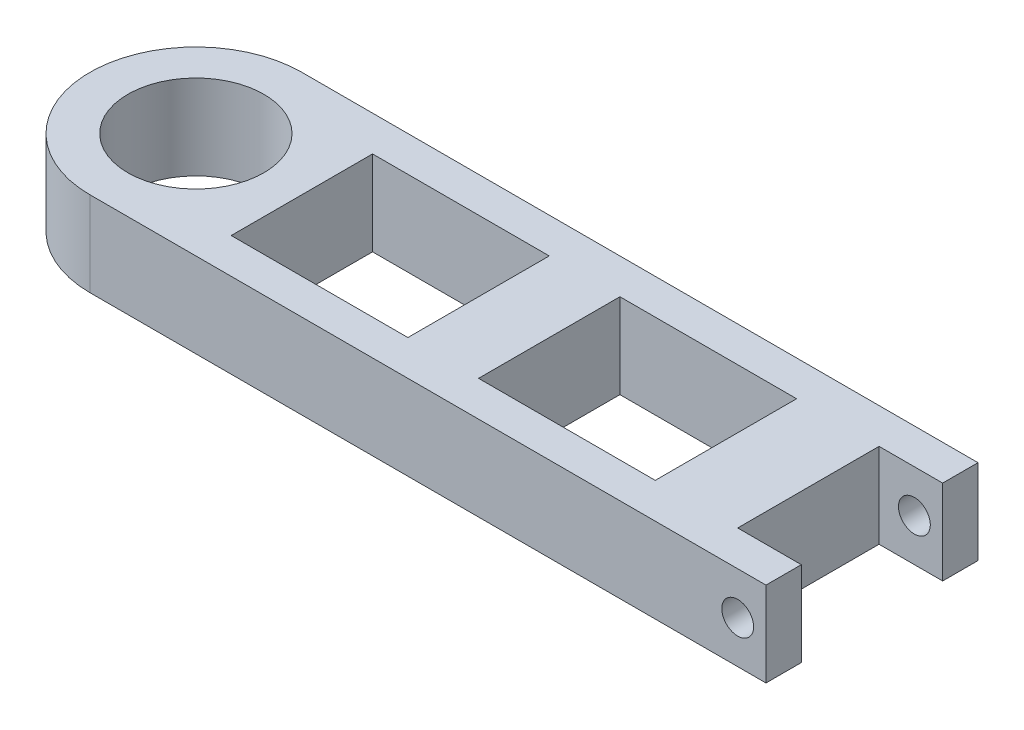
ISO-10303-21;
HEADER;
FILE_DESCRIPTION(('STEP AP214'),'2;1');
FILE_NAME('part.step','',(''),(''),'','','');
FILE_SCHEMA(('AUTOMOTIVE_DESIGN { 1 0 10303 214 1 1 1 1 }'));
ENDSEC;
DATA;
#1=APPLICATION_CONTEXT('core data for automotive mechanical design processes');
#2=APPLICATION_PROTOCOL_DEFINITION('international standard','automotive_design',2000,#1);
#3=PRODUCT_CONTEXT('',#1,'mechanical');
#4=PRODUCT('Part','Part','',(#3));
#5=PRODUCT_RELATED_PRODUCT_CATEGORY('part','',(#4));
#6=PRODUCT_DEFINITION_FORMATION('','',#4);
#7=PRODUCT_DEFINITION_CONTEXT('part definition',#1,'design');
#8=PRODUCT_DEFINITION('design','',#6,#7);
#9=PRODUCT_DEFINITION_SHAPE('','',#8);
#10=(LENGTH_UNIT() NAMED_UNIT(*) SI_UNIT(.MILLI.,.METRE.));
#11=(NAMED_UNIT(*) PLANE_ANGLE_UNIT() SI_UNIT($,.RADIAN.));
#12=(NAMED_UNIT(*) SI_UNIT($,.STERADIAN.) SOLID_ANGLE_UNIT());
#13=UNCERTAINTY_MEASURE_WITH_UNIT(LENGTH_MEASURE(1.E-05),#10,'distance_accuracy_value','');
#14=(GEOMETRIC_REPRESENTATION_CONTEXT(3) GLOBAL_UNCERTAINTY_ASSIGNED_CONTEXT((#13)) GLOBAL_UNIT_ASSIGNED_CONTEXT((#10,
#11,#12)) REPRESENTATION_CONTEXT('',''));
#15=CARTESIAN_POINT('',(0.,0.,0.));
#16=DIRECTION('',(0.,0.,1.));
#17=DIRECTION('',(1.,0.,0.));
#18=AXIS2_PLACEMENT_3D('',#15,#16,#17);
#19=CARTESIAN_POINT('',(-135.,12.,0.));
#20=DIRECTION('',(0.,1.,0.));
#21=DIRECTION('',(0.,0.,1.));
#22=AXIS2_PLACEMENT_3D('',#19,#20,#21);
#23=PLANE('',#22);
#24=DIRECTION('',(1.,0.,0.));
#25=VECTOR('',#24,1.);
#26=CARTESIAN_POINT('',(-120.,12.,10.));
#27=LINE('',#26,#25);
#28=CARTESIAN_POINT('',(-120.,12.,10.));
#29=VERTEX_POINT('',#28);
#30=CARTESIAN_POINT('',(-95.,12.,10.));
#31=VERTEX_POINT('',#30);
#32=EDGE_CURVE('E193',#29,#31,#27,.T.);
#33=ORIENTED_EDGE('',*,*,#32,.F.);
#34=DIRECTION('',(0.,0.,1.));
#35=VECTOR('',#34,1.);
#36=CARTESIAN_POINT('',(-120.,12.,-10.));
#37=LINE('',#36,#35);
#38=CARTESIAN_POINT('',(-120.,12.,-10.));
#39=VERTEX_POINT('',#38);
#40=EDGE_CURVE('E191',#39,#29,#37,.T.);
#41=ORIENTED_EDGE('',*,*,#40,.F.);
#42=DIRECTION('',(-1.,0.,0.));
#43=VECTOR('',#42,1.);
#44=CARTESIAN_POINT('',(-120.,12.,-10.));
#45=LINE('',#44,#43);
#46=CARTESIAN_POINT('',(-95.,12.,-10.));
#47=VERTEX_POINT('',#46);
#48=EDGE_CURVE('E199',#47,#39,#45,.T.);
#49=ORIENTED_EDGE('',*,*,#48,.F.);
#50=DIRECTION('',(0.,0.,-1.));
#51=VECTOR('',#50,1.);
#52=CARTESIAN_POINT('',(-95.,12.,-10.));
#53=LINE('',#52,#51);
#54=EDGE_CURVE('E196',#31,#47,#53,.T.);
#55=ORIENTED_EDGE('',*,*,#54,.F.);
#56=EDGE_LOOP('',(#33,#41,#49,#55));
#57=FACE_BOUND('',#56,.T.);
#58=DIRECTION('',(1.,0.,0.));
#59=VECTOR('',#58,1.);
#60=CARTESIAN_POINT('',(-39.3333,12.,-10.));
#61=LINE('',#60,#59);
#62=CARTESIAN_POINT('',(-48.3333,12.,-10.));
#63=VERTEX_POINT('',#62);
#64=CARTESIAN_POINT('',(-39.3333,12.,-10.));
#65=VERTEX_POINT('',#64);
#66=EDGE_CURVE('E222',#63,#65,#61,.T.);
#67=ORIENTED_EDGE('',*,*,#66,.T.);
#68=DIRECTION('',(0.,0.,-1.));
#69=VECTOR('',#68,1.);
#70=CARTESIAN_POINT('',(-39.3333,12.,-15.));
#71=LINE('',#70,#69);
#72=CARTESIAN_POINT('',(-39.3333,12.,-15.));
#73=VERTEX_POINT('',#72);
#74=EDGE_CURVE('E225',#65,#73,#71,.T.);
#75=ORIENTED_EDGE('',*,*,#74,.T.);
#76=DIRECTION('',(-1.,0.,0.));
#77=VECTOR('',#76,1.);
#78=CARTESIAN_POINT('',(-135.,12.,-15.));
#79=LINE('',#78,#77);
#80=CARTESIAN_POINT('',(-135.,12.,-15.));
#81=VERTEX_POINT('',#80);
#82=EDGE_CURVE('E228',#73,#81,#79,.T.);
#83=ORIENTED_EDGE('',*,*,#82,.T.);
#84=CARTESIAN_POINT('',(-135.,12.,0.));
#85=DIRECTION('',(0.,1.,0.));
#86=DIRECTION('',(0.,0.,1.));
#87=AXIS2_PLACEMENT_3D('',#84,#85,#86);
#88=CIRCLE('',#87,15.);
#89=CARTESIAN_POINT('',(-135.,12.,15.));
#90=VERTEX_POINT('',#89);
#91=EDGE_CURVE('E230',#81,#90,#88,.T.);
#92=ORIENTED_EDGE('',*,*,#91,.T.);
#93=DIRECTION('',(1.,0.,0.));
#94=VECTOR('',#93,1.);
#95=CARTESIAN_POINT('',(-135.,12.,15.));
#96=LINE('',#95,#94);
#97=CARTESIAN_POINT('',(-39.3333,12.,15.));
#98=VERTEX_POINT('',#97);
#99=EDGE_CURVE('E232',#90,#98,#96,.T.);
#100=ORIENTED_EDGE('',*,*,#99,.T.);
#101=DIRECTION('',(0.,0.,-1.));
#102=VECTOR('',#101,1.);
#103=CARTESIAN_POINT('',(-39.3333,12.,10.));
#104=LINE('',#103,#102);
#105=CARTESIAN_POINT('',(-39.3333,12.,10.));
#106=VERTEX_POINT('',#105);
#107=EDGE_CURVE('E234',#98,#106,#104,.T.);
#108=ORIENTED_EDGE('',*,*,#107,.T.);
#109=DIRECTION('',(-1.,0.,0.));
#110=VECTOR('',#109,1.);
#111=CARTESIAN_POINT('',(-48.3333,12.,10.));
#112=LINE('',#111,#110);
#113=CARTESIAN_POINT('',(-48.3333,12.,10.));
#114=VERTEX_POINT('',#113);
#115=EDGE_CURVE('E236',#106,#114,#112,.T.);
#116=ORIENTED_EDGE('',*,*,#115,.T.);
#117=DIRECTION('',(0.,0.,-1.));
#118=VECTOR('',#117,1.);
#119=CARTESIAN_POINT('',(-48.3333,12.,-10.));
#120=LINE('',#119,#118);
#121=EDGE_CURVE('E238',#114,#63,#120,.T.);
#122=ORIENTED_EDGE('',*,*,#121,.T.);
#123=EDGE_LOOP('',(#67,#75,#83,#92,#100,#108,#116,#122));
#124=FACE_BOUND('',#123,.T.);
#125=CARTESIAN_POINT('',(-135.,12.,0.));
#126=DIRECTION('',(0.,1.,0.));
#127=DIRECTION('',(0.,0.,1.));
#128=AXIS2_PLACEMENT_3D('',#125,#126,#127);
#129=CIRCLE('',#128,9.62499999999999);
#130=CARTESIAN_POINT('',(-135.,12.,9.62499999999999));
#131=VERTEX_POINT('',#130);
#132=EDGE_CURVE('E185',#131,#131,#129,.T.);
#133=ORIENTED_EDGE('',*,*,#132,.F.);
#134=EDGE_LOOP('',(#133));
#135=FACE_BOUND('',#134,.T.);
#136=DIRECTION('',(1.,0.,0.));
#137=VECTOR('',#136,1.);
#138=CARTESIAN_POINT('',(-85.,12.,10.));
#139=LINE('',#138,#137);
#140=CARTESIAN_POINT('',(-85.,12.,10.));
#141=VERTEX_POINT('',#140);
#142=CARTESIAN_POINT('',(-60.,12.,10.));
#143=VERTEX_POINT('',#142);
#144=EDGE_CURVE('E155',#141,#143,#139,.T.);
#145=ORIENTED_EDGE('',*,*,#144,.F.);
#146=DIRECTION('',(0.,0.,1.));
#147=VECTOR('',#146,1.);
#148=CARTESIAN_POINT('',(-85.,12.,-10.));
#149=LINE('',#148,#147);
#150=CARTESIAN_POINT('',(-85.,12.,-10.));
#151=VERTEX_POINT('',#150);
#152=EDGE_CURVE('E147',#151,#141,#149,.T.);
#153=ORIENTED_EDGE('',*,*,#152,.F.);
#154=DIRECTION('',(-1.,0.,0.));
#155=VECTOR('',#154,1.);
#156=CARTESIAN_POINT('',(-85.,12.,-10.));
#157=LINE('',#156,#155);
#158=CARTESIAN_POINT('',(-60.,12.,-10.));
#159=VERTEX_POINT('',#158);
#160=EDGE_CURVE('E169',#159,#151,#157,.T.);
#161=ORIENTED_EDGE('',*,*,#160,.F.);
#162=DIRECTION('',(0.,0.,-1.));
#163=VECTOR('',#162,1.);
#164=CARTESIAN_POINT('',(-60.,12.,-10.));
#165=LINE('',#164,#163);
#166=EDGE_CURVE('E167',#143,#159,#165,.T.);
#167=ORIENTED_EDGE('',*,*,#166,.F.);
#168=EDGE_LOOP('',(#145,#153,#161,#167));
#169=FACE_BOUND('',#168,.T.);
#170=ADVANCED_FACE('F33',(#57,#124,#135,#169),#23,.T.);
#171=CARTESIAN_POINT('',(-135.,0.,0.));
#172=DIRECTION('',(0.,1.,0.));
#173=DIRECTION('',(0.,0.,1.));
#174=AXIS2_PLACEMENT_3D('',#171,#172,#173);
#175=PLANE('',#174);
#176=CARTESIAN_POINT('',(-135.,0.,0.));
#177=DIRECTION('',(0.,1.,0.));
#178=DIRECTION('',(0.,0.,1.));
#179=AXIS2_PLACEMENT_3D('',#176,#177,#178);
#180=CIRCLE('',#179,9.62499999999999);
#181=CARTESIAN_POINT('',(-135.,0.,9.62499999999999));
#182=VERTEX_POINT('',#181);
#183=EDGE_CURVE('E163',#182,#182,#180,.T.);
#184=ORIENTED_EDGE('',*,*,#183,.T.);
#185=EDGE_LOOP('',(#184));
#186=FACE_BOUND('',#185,.T.);
#187=DIRECTION('',(0.,0.,1.));
#188=VECTOR('',#187,1.);
#189=CARTESIAN_POINT('',(-120.,0.,-10.));
#190=LINE('',#189,#188);
#191=CARTESIAN_POINT('',(-120.,0.,-10.));
#192=VERTEX_POINT('',#191);
#193=CARTESIAN_POINT('',(-120.,0.,10.));
#194=VERTEX_POINT('',#193);
#195=EDGE_CURVE('E188',#192,#194,#190,.T.);
#196=ORIENTED_EDGE('',*,*,#195,.T.);
#197=DIRECTION('',(1.,0.,0.));
#198=VECTOR('',#197,1.);
#199=CARTESIAN_POINT('',(-120.,0.,10.));
#200=LINE('',#199,#198);
#201=CARTESIAN_POINT('',(-95.,0.,10.));
#202=VERTEX_POINT('',#201);
#203=EDGE_CURVE('E204',#194,#202,#200,.T.);
#204=ORIENTED_EDGE('',*,*,#203,.T.);
#205=DIRECTION('',(0.,0.,-1.));
#206=VECTOR('',#205,1.);
#207=CARTESIAN_POINT('',(-95.,0.,-10.));
#208=LINE('',#207,#206);
#209=CARTESIAN_POINT('',(-95.,0.,-10.));
#210=VERTEX_POINT('',#209);
#211=EDGE_CURVE('E207',#202,#210,#208,.T.);
#212=ORIENTED_EDGE('',*,*,#211,.T.);
#213=DIRECTION('',(-1.,0.,0.));
#214=VECTOR('',#213,1.);
#215=CARTESIAN_POINT('',(-120.,0.,-10.));
#216=LINE('',#215,#214);
#217=EDGE_CURVE('E194',#210,#192,#216,.T.);
#218=ORIENTED_EDGE('',*,*,#217,.T.);
#219=EDGE_LOOP('',(#196,#204,#212,#218));
#220=FACE_BOUND('',#219,.T.);
#221=DIRECTION('',(1.,0.,0.));
#222=VECTOR('',#221,1.);
#223=CARTESIAN_POINT('',(-39.3333,0.,-10.));
#224=LINE('',#223,#222);
#225=CARTESIAN_POINT('',(-48.3333,0.,-10.));
#226=VERTEX_POINT('',#225);
#227=CARTESIAN_POINT('',(-39.3333,0.,-10.));
#228=VERTEX_POINT('',#227);
#229=EDGE_CURVE('E221',#226,#228,#224,.T.);
#230=ORIENTED_EDGE('',*,*,#229,.F.);
#231=DIRECTION('',(0.,0.,-1.));
#232=VECTOR('',#231,1.);
#233=CARTESIAN_POINT('',(-48.3333,0.,-10.));
#234=LINE('',#233,#232);
#235=CARTESIAN_POINT('',(-48.3333,0.,10.));
#236=VERTEX_POINT('',#235);
#237=EDGE_CURVE('E226',#236,#226,#234,.T.);
#238=ORIENTED_EDGE('',*,*,#237,.F.);
#239=DIRECTION('',(-1.,0.,0.));
#240=VECTOR('',#239,1.);
#241=CARTESIAN_POINT('',(-48.3333,0.,10.));
#242=LINE('',#241,#240);
#243=CARTESIAN_POINT('',(-39.3333,0.,10.));
#244=VERTEX_POINT('',#243);
#245=EDGE_CURVE('E253',#244,#236,#242,.T.);
#246=ORIENTED_EDGE('',*,*,#245,.F.);
#247=DIRECTION('',(0.,0.,-1.));
#248=VECTOR('',#247,1.);
#249=CARTESIAN_POINT('',(-39.3333,0.,10.));
#250=LINE('',#249,#248);
#251=CARTESIAN_POINT('',(-39.3333,0.,15.));
#252=VERTEX_POINT('',#251);
#253=EDGE_CURVE('E251',#252,#244,#250,.T.);
#254=ORIENTED_EDGE('',*,*,#253,.F.);
#255=DIRECTION('',(1.,0.,0.));
#256=VECTOR('',#255,1.);
#257=CARTESIAN_POINT('',(-135.,0.,15.));
#258=LINE('',#257,#256);
#259=CARTESIAN_POINT('',(-135.,0.,15.));
#260=VERTEX_POINT('',#259);
#261=EDGE_CURVE('E249',#260,#252,#258,.T.);
#262=ORIENTED_EDGE('',*,*,#261,.F.);
#263=CARTESIAN_POINT('',(-135.,0.,0.));
#264=DIRECTION('',(0.,1.,0.));
#265=DIRECTION('',(0.,0.,1.));
#266=AXIS2_PLACEMENT_3D('',#263,#264,#265);
#267=CIRCLE('',#266,15.);
#268=CARTESIAN_POINT('',(-135.,0.,-15.));
#269=VERTEX_POINT('',#268);
#270=EDGE_CURVE('E247',#269,#260,#267,.T.);
#271=ORIENTED_EDGE('',*,*,#270,.F.);
#272=DIRECTION('',(-1.,0.,0.));
#273=VECTOR('',#272,1.);
#274=CARTESIAN_POINT('',(-135.,0.,-15.));
#275=LINE('',#274,#273);
#276=CARTESIAN_POINT('',(-39.3333,0.,-15.));
#277=VERTEX_POINT('',#276);
#278=EDGE_CURVE('E245',#277,#269,#275,.T.);
#279=ORIENTED_EDGE('',*,*,#278,.F.);
#280=DIRECTION('',(0.,0.,-1.));
#281=VECTOR('',#280,1.);
#282=CARTESIAN_POINT('',(-39.3333,0.,-15.));
#283=LINE('',#282,#281);
#284=EDGE_CURVE('E243',#228,#277,#283,.T.);
#285=ORIENTED_EDGE('',*,*,#284,.F.);
#286=EDGE_LOOP('',(#230,#238,#246,#254,#262,#271,#279,#285));
#287=FACE_BOUND('',#286,.T.);
#288=DIRECTION('',(0.,0.,1.));
#289=VECTOR('',#288,1.);
#290=CARTESIAN_POINT('',(-85.,0.,-10.));
#291=LINE('',#290,#289);
#292=CARTESIAN_POINT('',(-85.,0.,-10.));
#293=VERTEX_POINT('',#292);
#294=CARTESIAN_POINT('',(-85.,0.,10.));
#295=VERTEX_POINT('',#294);
#296=EDGE_CURVE('E57',#293,#295,#291,.T.);
#297=ORIENTED_EDGE('',*,*,#296,.T.);
#298=DIRECTION('',(1.,0.,0.));
#299=VECTOR('',#298,1.);
#300=CARTESIAN_POINT('',(-85.,0.,10.));
#301=LINE('',#300,#299);
#302=CARTESIAN_POINT('',(-60.,0.,10.));
#303=VERTEX_POINT('',#302);
#304=EDGE_CURVE('E162',#295,#303,#301,.T.);
#305=ORIENTED_EDGE('',*,*,#304,.T.);
#306=DIRECTION('',(0.,0.,-1.));
#307=VECTOR('',#306,1.);
#308=CARTESIAN_POINT('',(-60.,0.,-10.));
#309=LINE('',#308,#307);
#310=CARTESIAN_POINT('',(-60.,0.,-10.));
#311=VERTEX_POINT('',#310);
#312=EDGE_CURVE('E177',#303,#311,#309,.T.);
#313=ORIENTED_EDGE('',*,*,#312,.T.);
#314=DIRECTION('',(-1.,0.,0.));
#315=VECTOR('',#314,1.);
#316=CARTESIAN_POINT('',(-85.,0.,-10.));
#317=LINE('',#316,#315);
#318=EDGE_CURVE('E156',#311,#293,#317,.T.);
#319=ORIENTED_EDGE('',*,*,#318,.T.);
#320=EDGE_LOOP('',(#297,#305,#313,#319));
#321=FACE_BOUND('',#320,.T.);
#322=ADVANCED_FACE('F284',(#186,#220,#287,#321),#175,.F.);
#323=CARTESIAN_POINT('',(-39.3333,12.,-10.));
#324=DIRECTION('',(0.,0.,-1.));
#325=DIRECTION('',(-1.,0.,0.));
#326=AXIS2_PLACEMENT_3D('',#323,#324,#325);
#327=PLANE('',#326);
#328=CARTESIAN_POINT('',(-43.3333,6.,-10.));
#329=DIRECTION('',(0.,0.,-1.));
#330=DIRECTION('',(-1.,0.,0.));
#331=AXIS2_PLACEMENT_3D('',#328,#329,#330);
#332=CIRCLE('',#331,2.25);
#333=CARTESIAN_POINT('',(-45.5833,6.,-10.));
#334=VERTEX_POINT('',#333);
#335=EDGE_CURVE('E175',#334,#334,#332,.T.);
#336=ORIENTED_EDGE('',*,*,#335,.T.);
#337=EDGE_LOOP('',(#336));
#338=FACE_BOUND('',#337,.T.);
#339=ORIENTED_EDGE('',*,*,#229,.T.);
#340=DIRECTION('',(0.,-1.,0.));
#341=VECTOR('',#340,1.);
#342=CARTESIAN_POINT('',(-39.3333,12.,-10.));
#343=LINE('',#342,#341);
#344=EDGE_CURVE('E11',#65,#228,#343,.T.);
#345=ORIENTED_EDGE('',*,*,#344,.F.);
#346=ORIENTED_EDGE('',*,*,#66,.F.);
#347=DIRECTION('',(0.,-1.,0.));
#348=VECTOR('',#347,1.);
#349=CARTESIAN_POINT('',(-48.3333,12.,-10.));
#350=LINE('',#349,#348);
#351=EDGE_CURVE('E240',#63,#226,#350,.T.);
#352=ORIENTED_EDGE('',*,*,#351,.T.);
#353=EDGE_LOOP('',(#339,#345,#346,#352));
#354=FACE_BOUND('',#353,.T.);
#355=ADVANCED_FACE('F35',(#338,#354),#327,.F.);
#356=CARTESIAN_POINT('',(-39.3333,12.,-15.));
#357=DIRECTION('',(-1.,0.,0.));
#358=DIRECTION('',(0.,0.,1.));
#359=AXIS2_PLACEMENT_3D('',#356,#357,#358);
#360=PLANE('',#359);
#361=ORIENTED_EDGE('',*,*,#284,.T.);
#362=DIRECTION('',(0.,-1.,0.));
#363=VECTOR('',#362,1.);
#364=CARTESIAN_POINT('',(-39.3333,12.,-15.));
#365=LINE('',#364,#363);
#366=EDGE_CURVE('E42',#73,#277,#365,.T.);
#367=ORIENTED_EDGE('',*,*,#366,.F.);
#368=ORIENTED_EDGE('',*,*,#74,.F.);
#369=ORIENTED_EDGE('',*,*,#344,.T.);
#370=EDGE_LOOP('',(#361,#367,#368,#369));
#371=FACE_BOUND('',#370,.T.);
#372=ADVANCED_FACE('F302',(#371),#360,.F.);
#373=CARTESIAN_POINT('',(-135.,12.,-15.));
#374=DIRECTION('',(0.,0.,1.));
#375=DIRECTION('',(1.,0.,0.));
#376=AXIS2_PLACEMENT_3D('',#373,#374,#375);
#377=PLANE('',#376);
#378=CARTESIAN_POINT('',(-43.3333,6.,-15.));
#379=DIRECTION('',(0.,0.,-1.));
#380=DIRECTION('',(-1.,0.,0.));
#381=AXIS2_PLACEMENT_3D('',#378,#379,#380);
#382=CIRCLE('',#381,2.25);
#383=CARTESIAN_POINT('',(-45.5833,6.,-15.));
#384=VERTEX_POINT('',#383);
#385=EDGE_CURVE('E395',#384,#384,#382,.T.);
#386=ORIENTED_EDGE('',*,*,#385,.F.);
#387=EDGE_LOOP('',(#386));
#388=FACE_BOUND('',#387,.T.);
#389=ORIENTED_EDGE('',*,*,#278,.T.);
#390=DIRECTION('',(0.,-1.,0.));
#391=VECTOR('',#390,1.);
#392=CARTESIAN_POINT('',(-135.,12.,-15.));
#393=LINE('',#392,#391);
#394=EDGE_CURVE('E270',#81,#269,#393,.T.);
#395=ORIENTED_EDGE('',*,*,#394,.F.);
#396=ORIENTED_EDGE('',*,*,#82,.F.);
#397=ORIENTED_EDGE('',*,*,#366,.T.);
#398=EDGE_LOOP('',(#389,#395,#396,#397));
#399=FACE_BOUND('',#398,.T.);
#400=ADVANCED_FACE('F278',(#388,#399),#377,.F.);
#401=CARTESIAN_POINT('',(-135.,12.,0.));
#402=DIRECTION('',(0.,-1.,0.));
#403=DIRECTION('',(0.,0.,-1.));
#404=AXIS2_PLACEMENT_3D('',#401,#402,#403);
#405=CYLINDRICAL_SURFACE('',#404,15.);
#406=ORIENTED_EDGE('',*,*,#270,.T.);
#407=DIRECTION('',(0.,-1.,0.));
#408=VECTOR('',#407,1.);
#409=CARTESIAN_POINT('',(-135.,12.,15.));
#410=LINE('',#409,#408);
#411=EDGE_CURVE('E267',#90,#260,#410,.T.);
#412=ORIENTED_EDGE('',*,*,#411,.F.);
#413=ORIENTED_EDGE('',*,*,#91,.F.);
#414=ORIENTED_EDGE('',*,*,#394,.T.);
#415=EDGE_LOOP('',(#406,#412,#413,#414));
#416=FACE_BOUND('',#415,.T.);
#417=ADVANCED_FACE('F290',(#416),#405,.T.);
#418=CARTESIAN_POINT('',(-135.,12.,15.));
#419=DIRECTION('',(0.,0.,-1.));
#420=DIRECTION('',(-1.,0.,0.));
#421=AXIS2_PLACEMENT_3D('',#418,#419,#420);
#422=PLANE('',#421);
#423=CARTESIAN_POINT('',(-43.3333,6.,15.));
#424=DIRECTION('',(0.,0.,-1.));
#425=DIRECTION('',(-1.,0.,0.));
#426=AXIS2_PLACEMENT_3D('',#423,#424,#425);
#427=CIRCLE('',#426,2.25);
#428=CARTESIAN_POINT('',(-45.5833,6.,15.));
#429=VERTEX_POINT('',#428);
#430=EDGE_CURVE('E400',#429,#429,#427,.T.);
#431=ORIENTED_EDGE('',*,*,#430,.T.);
#432=EDGE_LOOP('',(#431));
#433=FACE_BOUND('',#432,.T.);
#434=ORIENTED_EDGE('',*,*,#261,.T.);
#435=DIRECTION('',(0.,-1.,0.));
#436=VECTOR('',#435,1.);
#437=CARTESIAN_POINT('',(-39.3333,12.,15.));
#438=LINE('',#437,#436);
#439=EDGE_CURVE('E264',#98,#252,#438,.T.);
#440=ORIENTED_EDGE('',*,*,#439,.F.);
#441=ORIENTED_EDGE('',*,*,#99,.F.);
#442=ORIENTED_EDGE('',*,*,#411,.T.);
#443=EDGE_LOOP('',(#434,#440,#441,#442));
#444=FACE_BOUND('',#443,.T.);
#445=ADVANCED_FACE('F294',(#433,#444),#422,.F.);
#446=CARTESIAN_POINT('',(-39.3333,12.,10.));
#447=DIRECTION('',(-1.,0.,0.));
#448=DIRECTION('',(0.,0.,1.));
#449=AXIS2_PLACEMENT_3D('',#446,#447,#448);
#450=PLANE('',#449);
#451=ORIENTED_EDGE('',*,*,#253,.T.);
#452=DIRECTION('',(0.,-1.,0.));
#453=VECTOR('',#452,1.);
#454=CARTESIAN_POINT('',(-39.3333,12.,10.));
#455=LINE('',#454,#453);
#456=EDGE_CURVE('E261',#106,#244,#455,.T.);
#457=ORIENTED_EDGE('',*,*,#456,.F.);
#458=ORIENTED_EDGE('',*,*,#107,.F.);
#459=ORIENTED_EDGE('',*,*,#439,.T.);
#460=EDGE_LOOP('',(#451,#457,#458,#459));
#461=FACE_BOUND('',#460,.T.);
#462=ADVANCED_FACE('F315',(#461),#450,.F.);
#463=CARTESIAN_POINT('',(-48.3333,12.,10.));
#464=DIRECTION('',(0.,0.,1.));
#465=DIRECTION('',(1.,0.,0.));
#466=AXIS2_PLACEMENT_3D('',#463,#464,#465);
#467=PLANE('',#466);
#468=CARTESIAN_POINT('',(-43.3333,6.,10.));
#469=DIRECTION('',(0.,0.,1.));
#470=DIRECTION('',(1.,0.,0.));
#471=AXIS2_PLACEMENT_3D('',#468,#469,#470);
#472=CIRCLE('',#471,2.25);
#473=CARTESIAN_POINT('',(-41.0833,6.,10.));
#474=VERTEX_POINT('',#473);
#475=EDGE_CURVE('E37',#474,#474,#472,.T.);
#476=ORIENTED_EDGE('',*,*,#475,.T.);
#477=EDGE_LOOP('',(#476));
#478=FACE_BOUND('',#477,.T.);
#479=ORIENTED_EDGE('',*,*,#245,.T.);
#480=DIRECTION('',(0.,-1.,0.));
#481=VECTOR('',#480,1.);
#482=CARTESIAN_POINT('',(-48.3333,12.,10.));
#483=LINE('',#482,#481);
#484=EDGE_CURVE('E258',#114,#236,#483,.T.);
#485=ORIENTED_EDGE('',*,*,#484,.F.);
#486=ORIENTED_EDGE('',*,*,#115,.F.);
#487=ORIENTED_EDGE('',*,*,#456,.T.);
#488=EDGE_LOOP('',(#479,#485,#486,#487));
#489=FACE_BOUND('',#488,.T.);
#490=ADVANCED_FACE('F313',(#478,#489),#467,.F.);
#491=CARTESIAN_POINT('',(-48.3333,12.,-10.));
#492=DIRECTION('',(-1.,0.,0.));
#493=DIRECTION('',(0.,0.,1.));
#494=AXIS2_PLACEMENT_3D('',#491,#492,#493);
#495=PLANE('',#494);
#496=ORIENTED_EDGE('',*,*,#237,.T.);
#497=ORIENTED_EDGE('',*,*,#351,.F.);
#498=ORIENTED_EDGE('',*,*,#121,.F.);
#499=ORIENTED_EDGE('',*,*,#484,.T.);
#500=EDGE_LOOP('',(#496,#497,#498,#499));
#501=FACE_BOUND('',#500,.T.);
#502=ADVANCED_FACE('F308',(#501),#495,.F.);
#503=CARTESIAN_POINT('',(-120.,12.,-10.));
#504=DIRECTION('',(1.,0.,0.));
#505=DIRECTION('',(0.,0.,-1.));
#506=AXIS2_PLACEMENT_3D('',#503,#504,#505);
#507=PLANE('',#506);
#508=ORIENTED_EDGE('',*,*,#195,.F.);
#509=DIRECTION('',(0.,-1.,0.));
#510=VECTOR('',#509,1.);
#511=CARTESIAN_POINT('',(-120.,12.,-10.));
#512=LINE('',#511,#510);
#513=EDGE_CURVE('E201',#39,#192,#512,.T.);
#514=ORIENTED_EDGE('',*,*,#513,.F.);
#515=ORIENTED_EDGE('',*,*,#40,.T.);
#516=DIRECTION('',(0.,-1.,0.));
#517=VECTOR('',#516,1.);
#518=CARTESIAN_POINT('',(-120.,12.,10.));
#519=LINE('',#518,#517);
#520=EDGE_CURVE('E218',#29,#194,#519,.T.);
#521=ORIENTED_EDGE('',*,*,#520,.T.);
#522=EDGE_LOOP('',(#508,#514,#515,#521));
#523=FACE_BOUND('',#522,.T.);
#524=ADVANCED_FACE('F336',(#523),#507,.T.);
#525=CARTESIAN_POINT('',(-120.,12.,10.));
#526=DIRECTION('',(0.,0.,-1.));
#527=DIRECTION('',(-1.,0.,0.));
#528=AXIS2_PLACEMENT_3D('',#525,#526,#527);
#529=PLANE('',#528);
#530=ORIENTED_EDGE('',*,*,#203,.F.);
#531=ORIENTED_EDGE('',*,*,#520,.F.);
#532=ORIENTED_EDGE('',*,*,#32,.T.);
#533=DIRECTION('',(0.,-1.,0.));
#534=VECTOR('',#533,1.);
#535=CARTESIAN_POINT('',(-95.,12.,10.));
#536=LINE('',#535,#534);
#537=EDGE_CURVE('E216',#31,#202,#536,.T.);
#538=ORIENTED_EDGE('',*,*,#537,.T.);
#539=EDGE_LOOP('',(#530,#531,#532,#538));
#540=FACE_BOUND('',#539,.T.);
#541=ADVANCED_FACE('F343',(#540),#529,.T.);
#542=CARTESIAN_POINT('',(-95.,12.,-10.));
#543=DIRECTION('',(-1.,0.,0.));
#544=DIRECTION('',(0.,0.,1.));
#545=AXIS2_PLACEMENT_3D('',#542,#543,#544);
#546=PLANE('',#545);
#547=ORIENTED_EDGE('',*,*,#211,.F.);
#548=ORIENTED_EDGE('',*,*,#537,.F.);
#549=ORIENTED_EDGE('',*,*,#54,.T.);
#550=DIRECTION('',(0.,-1.,0.));
#551=VECTOR('',#550,1.);
#552=CARTESIAN_POINT('',(-95.,12.,-10.));
#553=LINE('',#552,#551);
#554=EDGE_CURVE('E214',#47,#210,#553,.T.);
#555=ORIENTED_EDGE('',*,*,#554,.T.);
#556=EDGE_LOOP('',(#547,#548,#549,#555));
#557=FACE_BOUND('',#556,.T.);
#558=ADVANCED_FACE('F348',(#557),#546,.T.);
#559=CARTESIAN_POINT('',(-120.,12.,-10.));
#560=DIRECTION('',(0.,0.,1.));
#561=DIRECTION('',(1.,0.,0.));
#562=AXIS2_PLACEMENT_3D('',#559,#560,#561);
#563=PLANE('',#562);
#564=ORIENTED_EDGE('',*,*,#217,.F.);
#565=ORIENTED_EDGE('',*,*,#554,.F.);
#566=ORIENTED_EDGE('',*,*,#48,.T.);
#567=ORIENTED_EDGE('',*,*,#513,.T.);
#568=EDGE_LOOP('',(#564,#565,#566,#567));
#569=FACE_BOUND('',#568,.T.);
#570=ADVANCED_FACE('F356',(#569),#563,.T.);
#571=CARTESIAN_POINT('',(-135.,12.,0.));
#572=DIRECTION('',(0.,-1.,0.));
#573=DIRECTION('',(0.,0.,-1.));
#574=AXIS2_PLACEMENT_3D('',#571,#572,#573);
#575=CYLINDRICAL_SURFACE('',#574,9.62499999999999);
#576=ORIENTED_EDGE('',*,*,#132,.T.);
#577=EDGE_LOOP('',(#576));
#578=FACE_BOUND('',#577,.T.);
#579=ORIENTED_EDGE('',*,*,#183,.F.);
#580=EDGE_LOOP('',(#579));
#581=FACE_BOUND('',#580,.T.);
#582=ADVANCED_FACE('F367',(#578,#581),#575,.F.);
#583=CARTESIAN_POINT('',(-85.,12.,-10.));
#584=DIRECTION('',(1.,0.,0.));
#585=DIRECTION('',(0.,0.,-1.));
#586=AXIS2_PLACEMENT_3D('',#583,#584,#585);
#587=PLANE('',#586);
#588=ORIENTED_EDGE('',*,*,#296,.F.);
#589=DIRECTION('',(0.,-1.,0.));
#590=VECTOR('',#589,1.);
#591=CARTESIAN_POINT('',(-85.,12.,-10.));
#592=LINE('',#591,#590);
#593=EDGE_CURVE('E151',#151,#293,#592,.T.);
#594=ORIENTED_EDGE('',*,*,#593,.F.);
#595=ORIENTED_EDGE('',*,*,#152,.T.);
#596=DIRECTION('',(0.,-1.,0.));
#597=VECTOR('',#596,1.);
#598=CARTESIAN_POINT('',(-85.,12.,10.));
#599=LINE('',#598,#597);
#600=EDGE_CURVE('E150',#141,#295,#599,.T.);
#601=ORIENTED_EDGE('',*,*,#600,.T.);
#602=EDGE_LOOP('',(#588,#594,#595,#601));
#603=FACE_BOUND('',#602,.T.);
#604=ADVANCED_FACE('F149',(#603),#587,.T.);
#605=CARTESIAN_POINT('',(-85.,12.,10.));
#606=DIRECTION('',(0.,0.,-1.));
#607=DIRECTION('',(-1.,0.,0.));
#608=AXIS2_PLACEMENT_3D('',#605,#606,#607);
#609=PLANE('',#608);
#610=ORIENTED_EDGE('',*,*,#304,.F.);
#611=ORIENTED_EDGE('',*,*,#600,.F.);
#612=ORIENTED_EDGE('',*,*,#144,.T.);
#613=DIRECTION('',(0.,-1.,0.));
#614=VECTOR('',#613,1.);
#615=CARTESIAN_POINT('',(-60.,12.,10.));
#616=LINE('',#615,#614);
#617=EDGE_CURVE('E164',#143,#303,#616,.T.);
#618=ORIENTED_EDGE('',*,*,#617,.T.);
#619=EDGE_LOOP('',(#610,#611,#612,#618));
#620=FACE_BOUND('',#619,.T.);
#621=ADVANCED_FACE('F159',(#620),#609,.T.);
#622=CARTESIAN_POINT('',(-60.,12.,-10.));
#623=DIRECTION('',(-1.,0.,0.));
#624=DIRECTION('',(0.,0.,1.));
#625=AXIS2_PLACEMENT_3D('',#622,#623,#624);
#626=PLANE('',#625);
#627=ORIENTED_EDGE('',*,*,#312,.F.);
#628=ORIENTED_EDGE('',*,*,#617,.F.);
#629=ORIENTED_EDGE('',*,*,#166,.T.);
#630=DIRECTION('',(0.,-1.,0.));
#631=VECTOR('',#630,1.);
#632=CARTESIAN_POINT('',(-60.,12.,-10.));
#633=LINE('',#632,#631);
#634=EDGE_CURVE('E49',#159,#311,#633,.T.);
#635=ORIENTED_EDGE('',*,*,#634,.T.);
#636=EDGE_LOOP('',(#627,#628,#629,#635));
#637=FACE_BOUND('',#636,.T.);
#638=ADVANCED_FACE('F377',(#637),#626,.T.);
#639=CARTESIAN_POINT('',(-85.,12.,-10.));
#640=DIRECTION('',(0.,0.,1.));
#641=DIRECTION('',(1.,0.,0.));
#642=AXIS2_PLACEMENT_3D('',#639,#640,#641);
#643=PLANE('',#642);
#644=ORIENTED_EDGE('',*,*,#318,.F.);
#645=ORIENTED_EDGE('',*,*,#634,.F.);
#646=ORIENTED_EDGE('',*,*,#160,.T.);
#647=ORIENTED_EDGE('',*,*,#593,.T.);
#648=EDGE_LOOP('',(#644,#645,#646,#647));
#649=FACE_BOUND('',#648,.T.);
#650=ADVANCED_FACE('F380',(#649),#643,.T.);
#651=CARTESIAN_POINT('',(-43.3333,6.,15.));
#652=DIRECTION('',(0.,0.,-1.));
#653=DIRECTION('',(-1.,0.,0.));
#654=AXIS2_PLACEMENT_3D('',#651,#652,#653);
#655=CYLINDRICAL_SURFACE('',#654,2.25);
#656=ORIENTED_EDGE('',*,*,#430,.F.);
#657=EDGE_LOOP('',(#656));
#658=FACE_BOUND('',#657,.T.);
#659=ORIENTED_EDGE('',*,*,#475,.F.);
#660=EDGE_LOOP('',(#659));
#661=FACE_BOUND('',#660,.T.);
#662=ADVANCED_FACE('F384',(#658,#661),#655,.F.);
#663=ORIENTED_EDGE('',*,*,#385,.T.);
#664=EDGE_LOOP('',(#663));
#665=FACE_BOUND('',#664,.T.);
#666=ORIENTED_EDGE('',*,*,#335,.F.);
#667=EDGE_LOOP('',(#666));
#668=FACE_BOUND('',#667,.T.);
#669=ADVANCED_FACE('F385',(#665,#668),#655,.F.);
#670=CLOSED_SHELL('',(#170,#322,#355,#372,#400,#417,#445,#462,#490,#502,#524,#541,#558,#570,
#582,#604,#621,#638,#650,#662,#669));
#671=MANIFOLD_SOLID_BREP('B2',#670);
#672=ADVANCED_BREP_SHAPE_REPRESENTATION('',(#18,#671),#14);
#673=SHAPE_DEFINITION_REPRESENTATION(#9,#672);
ENDSEC;
END-ISO-10303-21;
